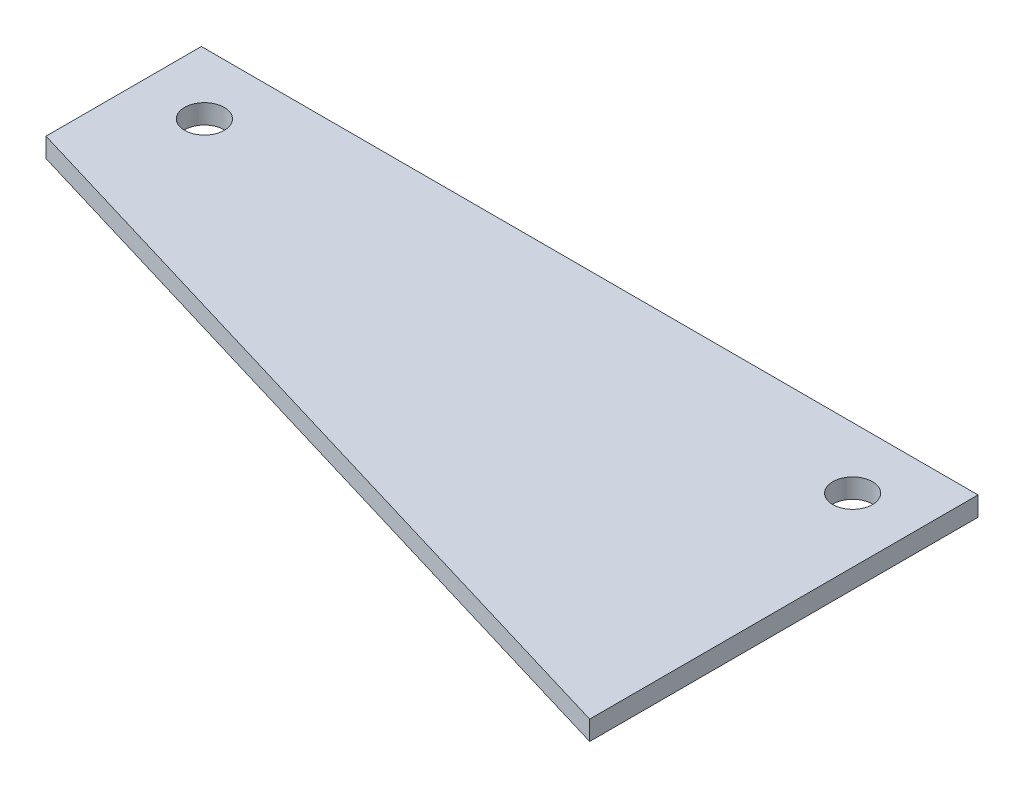
ISO-10303-21;
HEADER;
FILE_DESCRIPTION(('STEP AP214'),'2;1');
FILE_NAME('part.step','',(''),(''),'','','');
FILE_SCHEMA(('AUTOMOTIVE_DESIGN { 1 0 10303 214 1 1 1 1 }'));
ENDSEC;
DATA;
#1=APPLICATION_CONTEXT('core data for automotive mechanical design processes');
#2=APPLICATION_PROTOCOL_DEFINITION('international standard','automotive_design',2000,#1);
#3=PRODUCT_CONTEXT('',#1,'mechanical');
#4=PRODUCT('Part','Part','',(#3));
#5=PRODUCT_RELATED_PRODUCT_CATEGORY('part','',(#4));
#6=PRODUCT_DEFINITION_FORMATION('','',#4);
#7=PRODUCT_DEFINITION_CONTEXT('part definition',#1,'design');
#8=PRODUCT_DEFINITION('design','',#6,#7);
#9=PRODUCT_DEFINITION_SHAPE('','',#8);
#10=(LENGTH_UNIT() NAMED_UNIT(*) SI_UNIT(.MILLI.,.METRE.));
#11=(NAMED_UNIT(*) PLANE_ANGLE_UNIT() SI_UNIT($,.RADIAN.));
#12=(NAMED_UNIT(*) SI_UNIT($,.STERADIAN.) SOLID_ANGLE_UNIT());
#13=UNCERTAINTY_MEASURE_WITH_UNIT(LENGTH_MEASURE(1.E-05),#10,'distance_accuracy_value','');
#14=(GEOMETRIC_REPRESENTATION_CONTEXT(3) GLOBAL_UNCERTAINTY_ASSIGNED_CONTEXT((#13)) GLOBAL_UNIT_ASSIGNED_CONTEXT((#10,
#11,#12)) REPRESENTATION_CONTEXT('',''));
#15=CARTESIAN_POINT('',(0.,0.,0.));
#16=DIRECTION('',(0.,0.,1.));
#17=DIRECTION('',(1.,0.,0.));
#18=AXIS2_PLACEMENT_3D('',#15,#16,#17);
#19=CARTESIAN_POINT('',(-63.5,3.175,38.1));
#20=DIRECTION('',(-1.,0.,0.));
#21=DIRECTION('',(0.,0.,1.));
#22=AXIS2_PLACEMENT_3D('',#19,#20,#21);
#23=PLANE('',#22);
#24=DIRECTION('',(0.,0.,-1.));
#25=VECTOR('',#24,1.);
#26=CARTESIAN_POINT('',(-63.5,0.,38.1));
#27=LINE('',#26,#25);
#28=CARTESIAN_POINT('',(-63.5,0.,-12.7));
#29=VERTEX_POINT('',#28);
#30=CARTESIAN_POINT('',(-63.5,0.,-38.1));
#31=VERTEX_POINT('',#30);
#32=EDGE_CURVE('E93',#29,#31,#27,.T.);
#33=ORIENTED_EDGE('',*,*,#32,.F.);
#34=DIRECTION('',(0.,1.,0.));
#35=VECTOR('',#34,1.);
#36=CARTESIAN_POINT('',(-63.5,0.,-12.7));
#37=LINE('',#36,#35);
#38=CARTESIAN_POINT('',(-63.5,3.175,-12.7));
#39=VERTEX_POINT('',#38);
#40=EDGE_CURVE('E52',#29,#39,#37,.T.);
#41=ORIENTED_EDGE('',*,*,#40,.T.);
#42=DIRECTION('',(0.,0.,-1.));
#43=VECTOR('',#42,1.);
#44=CARTESIAN_POINT('',(-63.5,3.175,38.1));
#45=LINE('',#44,#43);
#46=CARTESIAN_POINT('',(-63.5,3.175,-38.1));
#47=VERTEX_POINT('',#46);
#48=EDGE_CURVE('E83',#39,#47,#45,.T.);
#49=ORIENTED_EDGE('',*,*,#48,.T.);
#50=DIRECTION('',(0.,-1.,0.));
#51=VECTOR('',#50,1.);
#52=CARTESIAN_POINT('',(-63.5,3.175,-38.1));
#53=LINE('',#52,#51);
#54=EDGE_CURVE('E40',#47,#31,#53,.T.);
#55=ORIENTED_EDGE('',*,*,#54,.T.);
#56=EDGE_LOOP('',(#33,#41,#49,#55));
#57=FACE_BOUND('',#56,.T.);
#58=ADVANCED_FACE('F37',(#57),#23,.T.);
#59=CARTESIAN_POINT('',(63.5,3.175,38.1));
#60=DIRECTION('',(-1.,0.,0.));
#61=DIRECTION('',(0.,0.,1.));
#62=AXIS2_PLACEMENT_3D('',#59,#60,#61);
#63=PLANE('',#62);
#64=DIRECTION('',(0.,1.,0.));
#65=VECTOR('',#64,1.);
#66=CARTESIAN_POINT('',(63.5,0.,25.4));
#67=LINE('',#66,#65);
#68=CARTESIAN_POINT('',(63.5,0.,25.4));
#69=VERTEX_POINT('',#68);
#70=CARTESIAN_POINT('',(63.5,3.175,25.4));
#71=VERTEX_POINT('',#70);
#72=EDGE_CURVE('E79',#69,#71,#67,.T.);
#73=ORIENTED_EDGE('',*,*,#72,.F.);
#74=DIRECTION('',(0.,0.,-1.));
#75=VECTOR('',#74,1.);
#76=CARTESIAN_POINT('',(63.5,0.,38.1));
#77=LINE('',#76,#75);
#78=CARTESIAN_POINT('',(63.5,0.,-38.1));
#79=VERTEX_POINT('',#78);
#80=EDGE_CURVE('E75',#69,#79,#77,.T.);
#81=ORIENTED_EDGE('',*,*,#80,.T.);
#82=DIRECTION('',(0.,-1.,0.));
#83=VECTOR('',#82,1.);
#84=CARTESIAN_POINT('',(63.5,3.175,-38.1));
#85=LINE('',#84,#83);
#86=CARTESIAN_POINT('',(63.5,3.175,-38.1));
#87=VERTEX_POINT('',#86);
#88=EDGE_CURVE('E11',#87,#79,#85,.T.);
#89=ORIENTED_EDGE('',*,*,#88,.F.);
#90=DIRECTION('',(0.,0.,-1.));
#91=VECTOR('',#90,1.);
#92=CARTESIAN_POINT('',(63.5,3.175,38.1));
#93=LINE('',#92,#91);
#94=EDGE_CURVE('E61',#71,#87,#93,.T.);
#95=ORIENTED_EDGE('',*,*,#94,.F.);
#96=EDGE_LOOP('',(#73,#81,#89,#95));
#97=FACE_BOUND('',#96,.T.);
#98=ADVANCED_FACE('F76',(#97),#63,.F.);
#99=CARTESIAN_POINT('',(0.,3.175,0.));
#100=DIRECTION('',(0.,-1.,0.));
#101=DIRECTION('',(0.,0.,-1.));
#102=AXIS2_PLACEMENT_3D('',#99,#100,#101);
#103=PLANE('',#102);
#104=CARTESIAN_POINT('',(53.0000000000001,3.175,-28.1));
#105=DIRECTION('',(0.,1.,0.));
#106=DIRECTION('',(0.,0.,1.));
#107=AXIS2_PLACEMENT_3D('',#104,#105,#106);
#108=CIRCLE('',#107,3.25);
#109=CARTESIAN_POINT('',(53.0000000000001,3.175,-24.85));
#110=VERTEX_POINT('',#109);
#111=EDGE_CURVE('E110',#110,#110,#108,.T.);
#112=ORIENTED_EDGE('',*,*,#111,.F.);
#113=EDGE_LOOP('',(#112));
#114=FACE_BOUND('',#113,.T.);
#115=CARTESIAN_POINT('',(-53.,3.175,-28.0999999999999));
#116=DIRECTION('',(0.,1.,0.));
#117=DIRECTION('',(0.,0.,1.));
#118=AXIS2_PLACEMENT_3D('',#115,#116,#117);
#119=CIRCLE('',#118,3.25);
#120=CARTESIAN_POINT('',(-53.,3.175,-24.8499999999999));
#121=VERTEX_POINT('',#120);
#122=EDGE_CURVE('E118',#121,#121,#119,.T.);
#123=ORIENTED_EDGE('',*,*,#122,.F.);
#124=EDGE_LOOP('',(#123));
#125=FACE_BOUND('',#124,.T.);
#126=DIRECTION('',(0.957826285221151,0.,0.287347885566345));
#127=VECTOR('',#126,1.);
#128=CARTESIAN_POINT('',(-1.74770642201835,3.175,5.8256880733945));
#129=LINE('',#128,#127);
#130=EDGE_CURVE('E122',#39,#71,#129,.T.);
#131=ORIENTED_EDGE('',*,*,#130,.T.);
#132=ORIENTED_EDGE('',*,*,#94,.T.);
#133=DIRECTION('',(1.,0.,0.));
#134=VECTOR('',#133,1.);
#135=CARTESIAN_POINT('',(-63.5,3.175,-38.1));
#136=LINE('',#135,#134);
#137=EDGE_CURVE('E90',#47,#87,#136,.T.);
#138=ORIENTED_EDGE('',*,*,#137,.F.);
#139=ORIENTED_EDGE('',*,*,#48,.F.);
#140=EDGE_LOOP('',(#131,#132,#138,#139));
#141=FACE_BOUND('',#140,.T.);
#142=ADVANCED_FACE('F138',(#114,#125,#141),#103,.F.);
#143=CARTESIAN_POINT('',(0.,0.,0.));
#144=DIRECTION('',(0.,-1.,0.));
#145=DIRECTION('',(0.,0.,-1.));
#146=AXIS2_PLACEMENT_3D('',#143,#144,#145);
#147=PLANE('',#146);
#148=CARTESIAN_POINT('',(-53.,0.,-28.0999999999999));
#149=DIRECTION('',(0.,1.,0.));
#150=DIRECTION('',(0.,0.,1.));
#151=AXIS2_PLACEMENT_3D('',#148,#149,#150);
#152=CIRCLE('',#151,3.25);
#153=CARTESIAN_POINT('',(-53.,0.,-24.8499999999999));
#154=VERTEX_POINT('',#153);
#155=EDGE_CURVE('E114',#154,#154,#152,.T.);
#156=ORIENTED_EDGE('',*,*,#155,.T.);
#157=EDGE_LOOP('',(#156));
#158=FACE_BOUND('',#157,.T.);
#159=CARTESIAN_POINT('',(53.0000000000001,0.,-28.1));
#160=DIRECTION('',(0.,1.,0.));
#161=DIRECTION('',(0.,0.,1.));
#162=AXIS2_PLACEMENT_3D('',#159,#160,#161);
#163=CIRCLE('',#162,3.25);
#164=CARTESIAN_POINT('',(53.0000000000001,0.,-24.85));
#165=VERTEX_POINT('',#164);
#166=EDGE_CURVE('E106',#165,#165,#163,.T.);
#167=ORIENTED_EDGE('',*,*,#166,.T.);
#168=EDGE_LOOP('',(#167));
#169=FACE_BOUND('',#168,.T.);
#170=ORIENTED_EDGE('',*,*,#80,.F.);
#171=DIRECTION('',(0.957826285221151,0.,0.287347885566345));
#172=VECTOR('',#171,1.);
#173=CARTESIAN_POINT('',(-1.74770642201835,0.,5.8256880733945));
#174=LINE('',#173,#172);
#175=EDGE_CURVE('E125',#29,#69,#174,.T.);
#176=ORIENTED_EDGE('',*,*,#175,.F.);
#177=ORIENTED_EDGE('',*,*,#32,.T.);
#178=DIRECTION('',(1.,0.,0.));
#179=VECTOR('',#178,1.);
#180=CARTESIAN_POINT('',(-63.5,0.,-38.1));
#181=LINE('',#180,#179);
#182=EDGE_CURVE('E84',#31,#79,#181,.T.);
#183=ORIENTED_EDGE('',*,*,#182,.T.);
#184=EDGE_LOOP('',(#170,#176,#177,#183));
#185=FACE_BOUND('',#184,.T.);
#186=ADVANCED_FACE('F91',(#158,#169,#185),#147,.T.);
#187=CARTESIAN_POINT('',(-63.5,3.175,-38.1));
#188=DIRECTION('',(0.,0.,-1.));
#189=DIRECTION('',(-1.,0.,0.));
#190=AXIS2_PLACEMENT_3D('',#187,#188,#189);
#191=PLANE('',#190);
#192=ORIENTED_EDGE('',*,*,#182,.F.);
#193=ORIENTED_EDGE('',*,*,#54,.F.);
#194=ORIENTED_EDGE('',*,*,#137,.T.);
#195=ORIENTED_EDGE('',*,*,#88,.T.);
#196=EDGE_LOOP('',(#192,#193,#194,#195));
#197=FACE_BOUND('',#196,.T.);
#198=ADVANCED_FACE('F88',(#197),#191,.T.);
#199=CARTESIAN_POINT('',(53.0000000000001,0.,-28.1));
#200=DIRECTION('',(0.,1.,0.));
#201=DIRECTION('',(0.,0.,1.));
#202=AXIS2_PLACEMENT_3D('',#199,#200,#201);
#203=CYLINDRICAL_SURFACE('',#202,3.25);
#204=ORIENTED_EDGE('',*,*,#166,.F.);
#205=EDGE_LOOP('',(#204));
#206=FACE_BOUND('',#205,.T.);
#207=ORIENTED_EDGE('',*,*,#111,.T.);
#208=EDGE_LOOP('',(#207));
#209=FACE_BOUND('',#208,.T.);
#210=ADVANCED_FACE('F178',(#206,#209),#203,.F.);
#211=CARTESIAN_POINT('',(-53.,0.,-28.0999999999999));
#212=DIRECTION('',(0.,1.,0.));
#213=DIRECTION('',(0.,0.,1.));
#214=AXIS2_PLACEMENT_3D('',#211,#212,#213);
#215=CYLINDRICAL_SURFACE('',#214,3.25);
#216=ORIENTED_EDGE('',*,*,#155,.F.);
#217=EDGE_LOOP('',(#216));
#218=FACE_BOUND('',#217,.T.);
#219=ORIENTED_EDGE('',*,*,#122,.T.);
#220=EDGE_LOOP('',(#219));
#221=FACE_BOUND('',#220,.T.);
#222=ADVANCED_FACE('F183',(#218,#221),#215,.F.);
#223=CARTESIAN_POINT('',(-1.74770642201835,0.,5.8256880733945));
#224=DIRECTION('',(-0.287347885566345,0.,0.957826285221151));
#225=DIRECTION('',(0.957826285221152,0.,0.287347885566345));
#226=AXIS2_PLACEMENT_3D('',#223,#224,#225);
#227=PLANE('',#226);
#228=ORIENTED_EDGE('',*,*,#130,.F.);
#229=ORIENTED_EDGE('',*,*,#40,.F.);
#230=ORIENTED_EDGE('',*,*,#175,.T.);
#231=ORIENTED_EDGE('',*,*,#72,.T.);
#232=EDGE_LOOP('',(#228,#229,#230,#231));
#233=FACE_BOUND('',#232,.T.);
#234=ADVANCED_FACE('F131',(#233),#227,.T.);
#235=CLOSED_SHELL('',(#58,#98,#142,#186,#198,#210,#222,#234));
#236=MANIFOLD_SOLID_BREP('B2',#235);
#237=ADVANCED_BREP_SHAPE_REPRESENTATION('',(#18,#236),#14);
#238=SHAPE_DEFINITION_REPRESENTATION(#9,#237);
ENDSEC;
END-ISO-10303-21;
